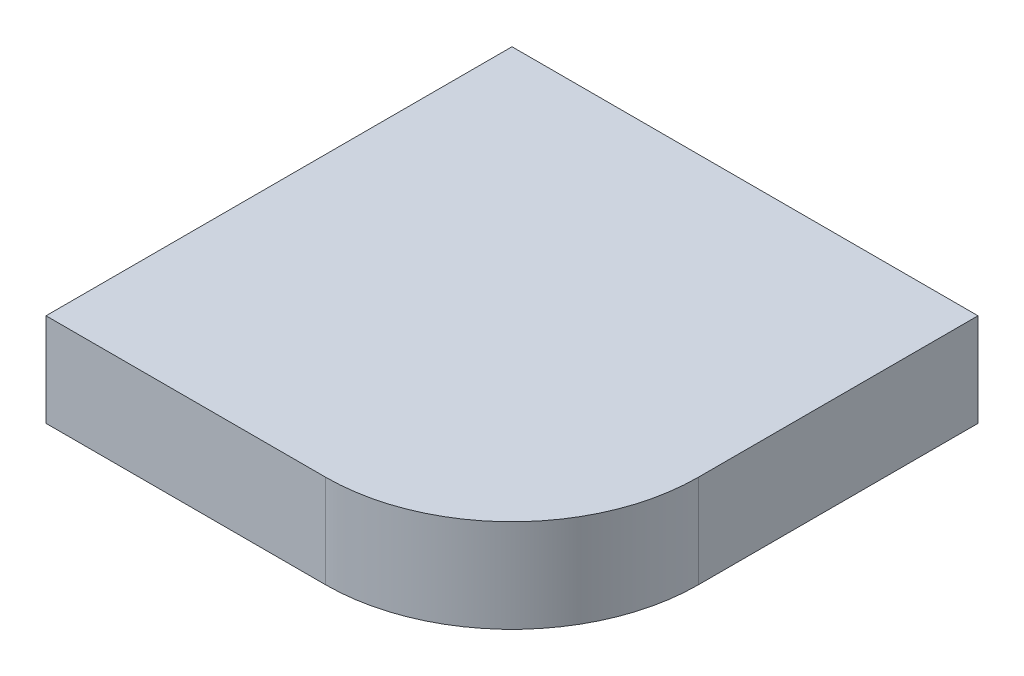
ISO-10303-21;
HEADER;
FILE_DESCRIPTION(('STEP AP214'),'2;1');
FILE_NAME('part.step','',(''),(''),'','','');
FILE_SCHEMA(('AUTOMOTIVE_DESIGN { 1 0 10303 214 1 1 1 1 }'));
ENDSEC;
DATA;
#1=APPLICATION_CONTEXT('core data for automotive mechanical design processes');
#2=APPLICATION_PROTOCOL_DEFINITION('international standard','automotive_design',2000,#1);
#3=PRODUCT_CONTEXT('',#1,'mechanical');
#4=PRODUCT('Part','Part','',(#3));
#5=PRODUCT_RELATED_PRODUCT_CATEGORY('part','',(#4));
#6=PRODUCT_DEFINITION_FORMATION('','',#4);
#7=PRODUCT_DEFINITION_CONTEXT('part definition',#1,'design');
#8=PRODUCT_DEFINITION('design','',#6,#7);
#9=PRODUCT_DEFINITION_SHAPE('','',#8);
#10=(LENGTH_UNIT() NAMED_UNIT(*) SI_UNIT(.MILLI.,.METRE.));
#11=(NAMED_UNIT(*) PLANE_ANGLE_UNIT() SI_UNIT($,.RADIAN.));
#12=(NAMED_UNIT(*) SI_UNIT($,.STERADIAN.) SOLID_ANGLE_UNIT());
#13=UNCERTAINTY_MEASURE_WITH_UNIT(LENGTH_MEASURE(1.E-05),#10,'distance_accuracy_value','');
#14=(GEOMETRIC_REPRESENTATION_CONTEXT(3) GLOBAL_UNCERTAINTY_ASSIGNED_CONTEXT((#13)) GLOBAL_UNIT_ASSIGNED_CONTEXT((#10,
#11,#12)) REPRESENTATION_CONTEXT('',''));
#15=CARTESIAN_POINT('',(0.,0.,0.));
#16=DIRECTION('',(0.,0.,1.));
#17=DIRECTION('',(1.,0.,0.));
#18=AXIS2_PLACEMENT_3D('',#15,#16,#17);
#19=CARTESIAN_POINT('',(0.,10.,0.));
#20=DIRECTION('',(0.,-1.,0.));
#21=DIRECTION('',(0.,0.,-1.));
#22=AXIS2_PLACEMENT_3D('',#19,#20,#21);
#23=CYLINDRICAL_SURFACE('',#22,20.);
#24=CARTESIAN_POINT('',(0.,0.,0.));
#25=DIRECTION('',(0.,1.,0.));
#26=DIRECTION('',(0.,0.,1.));
#27=AXIS2_PLACEMENT_3D('',#24,#25,#26);
#28=CIRCLE('',#27,20.);
#29=CARTESIAN_POINT('',(0.,0.,20.));
#30=VERTEX_POINT('',#29);
#31=CARTESIAN_POINT('',(20.,0.,0.));
#32=VERTEX_POINT('',#31);
#33=EDGE_CURVE('E107',#30,#32,#28,.T.);
#34=ORIENTED_EDGE('',*,*,#33,.T.);
#35=DIRECTION('',(0.,-1.,0.));
#36=VECTOR('',#35,1.);
#37=CARTESIAN_POINT('',(20.,10.,0.));
#38=LINE('',#37,#36);
#39=CARTESIAN_POINT('',(20.,10.,0.));
#40=VERTEX_POINT('',#39);
#41=EDGE_CURVE('E11',#40,#32,#38,.T.);
#42=ORIENTED_EDGE('',*,*,#41,.F.);
#43=CARTESIAN_POINT('',(0.,10.,0.));
#44=DIRECTION('',(0.,1.,0.));
#45=DIRECTION('',(0.,0.,1.));
#46=AXIS2_PLACEMENT_3D('',#43,#44,#45);
#47=CIRCLE('',#46,20.);
#48=CARTESIAN_POINT('',(0.,10.,20.));
#49=VERTEX_POINT('',#48);
#50=EDGE_CURVE('E115',#49,#40,#47,.T.);
#51=ORIENTED_EDGE('',*,*,#50,.F.);
#52=DIRECTION('',(0.,-1.,0.));
#53=VECTOR('',#52,1.);
#54=CARTESIAN_POINT('',(0.,10.,20.));
#55=LINE('',#54,#53);
#56=EDGE_CURVE('E103',#49,#30,#55,.T.);
#57=ORIENTED_EDGE('',*,*,#56,.T.);
#58=EDGE_LOOP('',(#34,#42,#51,#57));
#59=FACE_BOUND('',#58,.T.);
#60=ADVANCED_FACE('F33',(#59),#23,.T.);
#61=CARTESIAN_POINT('',(20.,10.,-30.));
#62=DIRECTION('',(-1.,0.,0.));
#63=DIRECTION('',(0.,0.,1.));
#64=AXIS2_PLACEMENT_3D('',#61,#62,#63);
#65=PLANE('',#64);
#66=DIRECTION('',(0.,0.,-1.));
#67=VECTOR('',#66,1.);
#68=CARTESIAN_POINT('',(20.,0.,-30.));
#69=LINE('',#68,#67);
#70=CARTESIAN_POINT('',(20.,0.,-30.));
#71=VERTEX_POINT('',#70);
#72=EDGE_CURVE('E110',#32,#71,#69,.T.);
#73=ORIENTED_EDGE('',*,*,#72,.T.);
#74=DIRECTION('',(0.,-1.,0.));
#75=VECTOR('',#74,1.);
#76=CARTESIAN_POINT('',(20.,10.,-30.));
#77=LINE('',#76,#75);
#78=CARTESIAN_POINT('',(20.,10.,-30.));
#79=VERTEX_POINT('',#78);
#80=EDGE_CURVE('E41',#79,#71,#77,.T.);
#81=ORIENTED_EDGE('',*,*,#80,.F.);
#82=DIRECTION('',(0.,0.,-1.));
#83=VECTOR('',#82,1.);
#84=CARTESIAN_POINT('',(20.,10.,-30.));
#85=LINE('',#84,#83);
#86=EDGE_CURVE('E83',#40,#79,#85,.T.);
#87=ORIENTED_EDGE('',*,*,#86,.F.);
#88=ORIENTED_EDGE('',*,*,#41,.T.);
#89=EDGE_LOOP('',(#73,#81,#87,#88));
#90=FACE_BOUND('',#89,.T.);
#91=ADVANCED_FACE('F134',(#90),#65,.F.);
#92=CARTESIAN_POINT('',(-30.,10.,-30.));
#93=DIRECTION('',(0.,0.,1.));
#94=DIRECTION('',(1.,0.,0.));
#95=AXIS2_PLACEMENT_3D('',#92,#93,#94);
#96=PLANE('',#95);
#97=DIRECTION('',(-1.,0.,0.));
#98=VECTOR('',#97,1.);
#99=CARTESIAN_POINT('',(-30.,0.,-30.));
#100=LINE('',#99,#98);
#101=CARTESIAN_POINT('',(-30.,0.,-30.));
#102=VERTEX_POINT('',#101);
#103=EDGE_CURVE('E98',#71,#102,#100,.T.);
#104=ORIENTED_EDGE('',*,*,#103,.T.);
#105=DIRECTION('',(0.,-1.,0.));
#106=VECTOR('',#105,1.);
#107=CARTESIAN_POINT('',(-30.,10.,-30.));
#108=LINE('',#107,#106);
#109=CARTESIAN_POINT('',(-30.,10.,-30.));
#110=VERTEX_POINT('',#109);
#111=EDGE_CURVE('E95',#110,#102,#108,.T.);
#112=ORIENTED_EDGE('',*,*,#111,.F.);
#113=DIRECTION('',(-1.,0.,0.));
#114=VECTOR('',#113,1.);
#115=CARTESIAN_POINT('',(-30.,10.,-30.));
#116=LINE('',#115,#114);
#117=EDGE_CURVE('E87',#79,#110,#116,.T.);
#118=ORIENTED_EDGE('',*,*,#117,.F.);
#119=ORIENTED_EDGE('',*,*,#80,.T.);
#120=EDGE_LOOP('',(#104,#112,#118,#119));
#121=FACE_BOUND('',#120,.T.);
#122=ADVANCED_FACE('F96',(#121),#96,.F.);
#123=CARTESIAN_POINT('',(-30.,10.,20.));
#124=DIRECTION('',(1.,0.,0.));
#125=DIRECTION('',(0.,0.,-1.));
#126=AXIS2_PLACEMENT_3D('',#123,#124,#125);
#127=PLANE('',#126);
#128=DIRECTION('',(0.,0.,1.));
#129=VECTOR('',#128,1.);
#130=CARTESIAN_POINT('',(-30.,0.,20.));
#131=LINE('',#130,#129);
#132=CARTESIAN_POINT('',(-30.,0.,20.));
#133=VERTEX_POINT('',#132);
#134=EDGE_CURVE('E69',#102,#133,#131,.T.);
#135=ORIENTED_EDGE('',*,*,#134,.T.);
#136=DIRECTION('',(0.,-1.,0.));
#137=VECTOR('',#136,1.);
#138=CARTESIAN_POINT('',(-30.,10.,20.));
#139=LINE('',#138,#137);
#140=CARTESIAN_POINT('',(-30.,10.,20.));
#141=VERTEX_POINT('',#140);
#142=EDGE_CURVE('E99',#141,#133,#139,.T.);
#143=ORIENTED_EDGE('',*,*,#142,.F.);
#144=DIRECTION('',(0.,0.,1.));
#145=VECTOR('',#144,1.);
#146=CARTESIAN_POINT('',(-30.,10.,20.));
#147=LINE('',#146,#145);
#148=EDGE_CURVE('E91',#110,#141,#147,.T.);
#149=ORIENTED_EDGE('',*,*,#148,.F.);
#150=ORIENTED_EDGE('',*,*,#111,.T.);
#151=EDGE_LOOP('',(#135,#143,#149,#150));
#152=FACE_BOUND('',#151,.T.);
#153=ADVANCED_FACE('F101',(#152),#127,.F.);
#154=CARTESIAN_POINT('',(0.,10.,20.));
#155=DIRECTION('',(0.,0.,-1.));
#156=DIRECTION('',(-1.,0.,0.));
#157=AXIS2_PLACEMENT_3D('',#154,#155,#156);
#158=PLANE('',#157);
#159=DIRECTION('',(1.,0.,0.));
#160=VECTOR('',#159,1.);
#161=CARTESIAN_POINT('',(0.,0.,20.));
#162=LINE('',#161,#160);
#163=EDGE_CURVE('E75',#133,#30,#162,.T.);
#164=ORIENTED_EDGE('',*,*,#163,.T.);
#165=ORIENTED_EDGE('',*,*,#56,.F.);
#166=DIRECTION('',(1.,0.,0.));
#167=VECTOR('',#166,1.);
#168=CARTESIAN_POINT('',(0.,10.,20.));
#169=LINE('',#168,#167);
#170=EDGE_CURVE('E49',#141,#49,#169,.T.);
#171=ORIENTED_EDGE('',*,*,#170,.F.);
#172=ORIENTED_EDGE('',*,*,#142,.T.);
#173=EDGE_LOOP('',(#164,#165,#171,#172));
#174=FACE_BOUND('',#173,.T.);
#175=ADVANCED_FACE('F123',(#174),#158,.F.);
#176=CARTESIAN_POINT('',(0.,10.,0.));
#177=DIRECTION('',(0.,1.,0.));
#178=DIRECTION('',(0.,0.,1.));
#179=AXIS2_PLACEMENT_3D('',#176,#177,#178);
#180=PLANE('',#179);
#181=ORIENTED_EDGE('',*,*,#50,.T.);
#182=ORIENTED_EDGE('',*,*,#86,.T.);
#183=ORIENTED_EDGE('',*,*,#117,.T.);
#184=ORIENTED_EDGE('',*,*,#148,.T.);
#185=ORIENTED_EDGE('',*,*,#170,.T.);
#186=EDGE_LOOP('',(#181,#182,#183,#184,#185));
#187=FACE_BOUND('',#186,.T.);
#188=ADVANCED_FACE('F89',(#187),#180,.T.);
#189=CARTESIAN_POINT('',(0.,0.,0.));
#190=DIRECTION('',(0.,1.,0.));
#191=DIRECTION('',(0.,0.,1.));
#192=AXIS2_PLACEMENT_3D('',#189,#190,#191);
#193=PLANE('',#192);
#194=ORIENTED_EDGE('',*,*,#33,.F.);
#195=ORIENTED_EDGE('',*,*,#163,.F.);
#196=ORIENTED_EDGE('',*,*,#134,.F.);
#197=ORIENTED_EDGE('',*,*,#103,.F.);
#198=ORIENTED_EDGE('',*,*,#72,.F.);
#199=EDGE_LOOP('',(#194,#195,#196,#197,#198));
#200=FACE_BOUND('',#199,.T.);
#201=ADVANCED_FACE('F119',(#200),#193,.F.);
#202=CLOSED_SHELL('',(#60,#91,#122,#153,#175,#188,#201));
#203=MANIFOLD_SOLID_BREP('B2',#202);
#204=ADVANCED_BREP_SHAPE_REPRESENTATION('',(#18,#203),#14);
#205=SHAPE_DEFINITION_REPRESENTATION(#9,#204);
ENDSEC;
END-ISO-10303-21;
